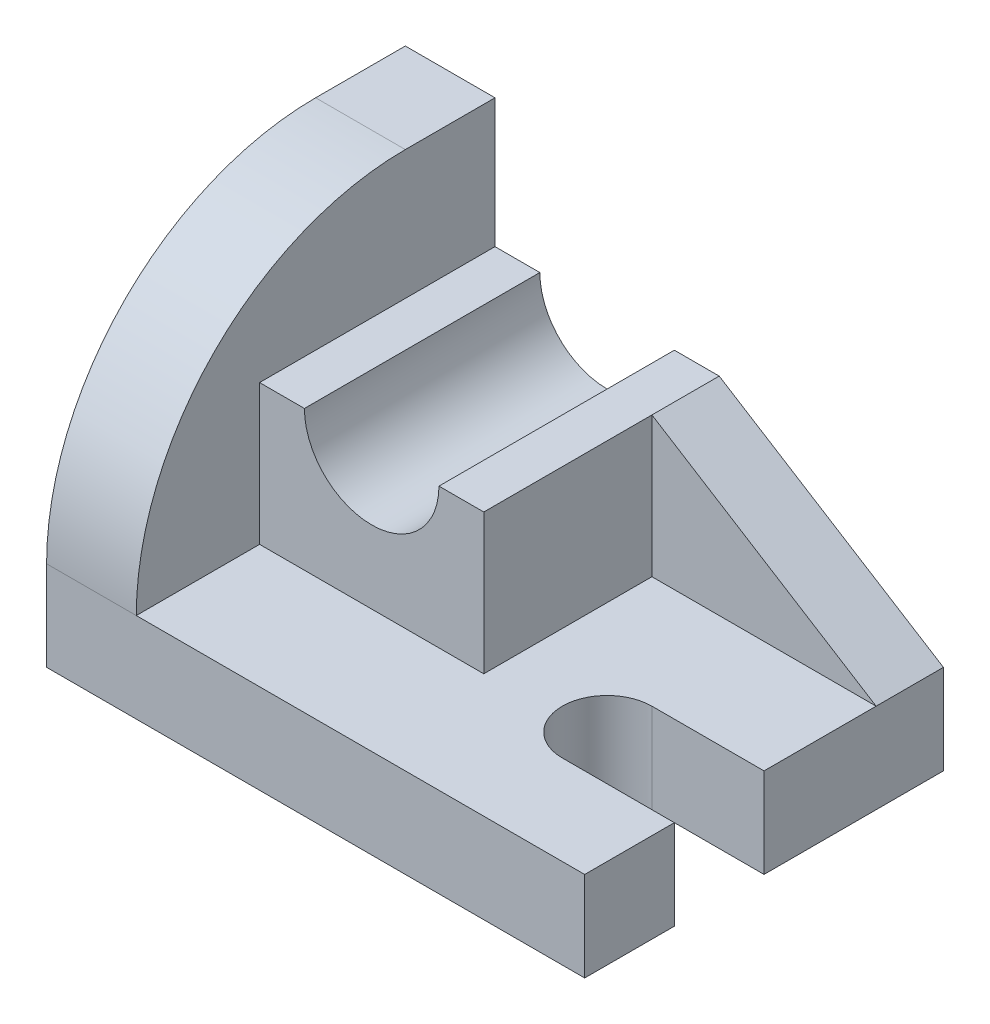
ISO-10303-21;
HEADER;
FILE_DESCRIPTION(('STEP AP214'),'2;1');
FILE_NAME('part.step','',(''),(''),'','','');
FILE_SCHEMA(('AUTOMOTIVE_DESIGN { 1 0 10303 214 1 1 1 1 }'));
ENDSEC;
DATA;
#1=APPLICATION_CONTEXT('core data for automotive mechanical design processes');
#2=APPLICATION_PROTOCOL_DEFINITION('international standard','automotive_design',2000,#1);
#3=PRODUCT_CONTEXT('',#1,'mechanical');
#4=PRODUCT('Part','Part','',(#3));
#5=PRODUCT_RELATED_PRODUCT_CATEGORY('part','',(#4));
#6=PRODUCT_DEFINITION_FORMATION('','',#4);
#7=PRODUCT_DEFINITION_CONTEXT('part definition',#1,'design');
#8=PRODUCT_DEFINITION('design','',#6,#7);
#9=PRODUCT_DEFINITION_SHAPE('','',#8);
#10=(LENGTH_UNIT() NAMED_UNIT(*) SI_UNIT(.MILLI.,.METRE.));
#11=(NAMED_UNIT(*) PLANE_ANGLE_UNIT() SI_UNIT($,.RADIAN.));
#12=(NAMED_UNIT(*) SI_UNIT($,.STERADIAN.) SOLID_ANGLE_UNIT());
#13=UNCERTAINTY_MEASURE_WITH_UNIT(LENGTH_MEASURE(1.E-05),#10,'distance_accuracy_value','');
#14=(GEOMETRIC_REPRESENTATION_CONTEXT(3) GLOBAL_UNCERTAINTY_ASSIGNED_CONTEXT((#13)) GLOBAL_UNIT_ASSIGNED_CONTEXT((#10,
#11,#12)) REPRESENTATION_CONTEXT('',''));
#15=CARTESIAN_POINT('',(0.,0.,0.));
#16=DIRECTION('',(0.,0.,1.));
#17=DIRECTION('',(1.,0.,0.));
#18=AXIS2_PLACEMENT_3D('',#15,#16,#17);
#19=CARTESIAN_POINT('',(0.,16.,0.));
#20=DIRECTION('',(0.,1.,0.));
#21=DIRECTION('',(0.,0.,1.));
#22=AXIS2_PLACEMENT_3D('',#19,#20,#21);
#23=PLANE('',#22);
#24=DIRECTION('',(0.,0.,-1.));
#25=VECTOR('',#24,1.);
#26=CARTESIAN_POINT('',(96.,16.,0.));
#27=LINE('',#26,#25);
#28=CARTESIAN_POINT('',(96.,16.,-32.));
#29=VERTEX_POINT('',#28);
#30=CARTESIAN_POINT('',(96.,16.,-52.));
#31=VERTEX_POINT('',#30);
#32=EDGE_CURVE('E111',#29,#31,#27,.T.);
#33=ORIENTED_EDGE('',*,*,#32,.T.);
#34=DIRECTION('',(-1.,0.,0.));
#35=VECTOR('',#34,1.);
#36=CARTESIAN_POINT('',(56.,16.,-52.));
#37=LINE('',#36,#35);
#38=CARTESIAN_POINT('',(56.,16.,-52.));
#39=VERTEX_POINT('',#38);
#40=EDGE_CURVE('E207',#31,#39,#37,.T.);
#41=ORIENTED_EDGE('',*,*,#40,.T.);
#42=DIRECTION('',(0.,0.,-1.));
#43=VECTOR('',#42,1.);
#44=CARTESIAN_POINT('',(56.,16.,-22.));
#45=LINE('',#44,#43);
#46=CARTESIAN_POINT('',(56.,16.,-22.));
#47=VERTEX_POINT('',#46);
#48=EDGE_CURVE('E167',#47,#39,#45,.T.);
#49=ORIENTED_EDGE('',*,*,#48,.F.);
#50=DIRECTION('',(1.,0.,0.));
#51=VECTOR('',#50,1.);
#52=CARTESIAN_POINT('',(0.,16.,-22.));
#53=LINE('',#52,#51);
#54=CARTESIAN_POINT('',(16.,16.,-22.));
#55=VERTEX_POINT('',#54);
#56=EDGE_CURVE('E186',#55,#47,#53,.T.);
#57=ORIENTED_EDGE('',*,*,#56,.F.);
#58=DIRECTION('',(0.,0.,-1.));
#59=VECTOR('',#58,1.);
#60=CARTESIAN_POINT('',(16.,16.,0.));
#61=LINE('',#60,#59);
#62=CARTESIAN_POINT('',(16.,15.9999999999997,0.));
#63=VERTEX_POINT('',#62);
#64=EDGE_CURVE('E107',#63,#55,#61,.T.);
#65=ORIENTED_EDGE('',*,*,#64,.F.);
#66=DIRECTION('',(1.,0.,0.));
#67=VECTOR('',#66,1.);
#68=CARTESIAN_POINT('',(0.,16.,0.));
#69=LINE('',#68,#67);
#70=CARTESIAN_POINT('',(96.,16.,0.));
#71=VERTEX_POINT('',#70);
#72=EDGE_CURVE('E99',#63,#71,#69,.T.);
#73=ORIENTED_EDGE('',*,*,#72,.T.);
#74=CARTESIAN_POINT('',(96.,16.,-16.));
#75=VERTEX_POINT('',#74);
#76=EDGE_CURVE('E103',#71,#75,#27,.T.);
#77=ORIENTED_EDGE('',*,*,#76,.T.);
#78=DIRECTION('',(-1.,0.,0.));
#79=VECTOR('',#78,1.);
#80=CARTESIAN_POINT('',(0.,16.,-16.));
#81=LINE('',#80,#79);
#82=CARTESIAN_POINT('',(76.,16.,-16.));
#83=VERTEX_POINT('',#82);
#84=EDGE_CURVE('E50',#75,#83,#81,.T.);
#85=ORIENTED_EDGE('',*,*,#84,.T.);
#86=CARTESIAN_POINT('',(76.,16.,-24.));
#87=DIRECTION('',(0.,1.,0.));
#88=DIRECTION('',(0.,0.,1.));
#89=AXIS2_PLACEMENT_3D('',#86,#87,#88);
#90=CIRCLE('',#89,8.);
#91=CARTESIAN_POINT('',(76.,16.,-32.));
#92=VERTEX_POINT('',#91);
#93=EDGE_CURVE('E131',#92,#83,#90,.T.);
#94=ORIENTED_EDGE('',*,*,#93,.F.);
#95=DIRECTION('',(-1.,0.,0.));
#96=VECTOR('',#95,1.);
#97=CARTESIAN_POINT('',(0.,16.,-32.));
#98=LINE('',#97,#96);
#99=EDGE_CURVE('E125',#29,#92,#98,.T.);
#100=ORIENTED_EDGE('',*,*,#99,.F.);
#101=EDGE_LOOP('',(#33,#41,#49,#57,#65,#73,#77,#85,#94,#100));
#102=FACE_BOUND('',#101,.T.);
#103=ADVANCED_FACE('F33',(#102),#23,.T.);
#104=CARTESIAN_POINT('',(56.,0.,-22.));
#105=DIRECTION('',(-1.,0.,0.));
#106=DIRECTION('',(0.,0.,1.));
#107=AXIS2_PLACEMENT_3D('',#104,#105,#106);
#108=PLANE('',#107);
#109=DIRECTION('',(0.,1.,0.));
#110=VECTOR('',#109,1.);
#111=CARTESIAN_POINT('',(56.,41.,-52.));
#112=LINE('',#111,#110);
#113=CARTESIAN_POINT('',(56.,41.,-52.));
#114=VERTEX_POINT('',#113);
#115=EDGE_CURVE('E210',#39,#114,#112,.T.);
#116=ORIENTED_EDGE('',*,*,#115,.T.);
#117=DIRECTION('',(0.,0.,-1.));
#118=VECTOR('',#117,1.);
#119=CARTESIAN_POINT('',(56.,41.,-22.));
#120=LINE('',#119,#118);
#121=CARTESIAN_POINT('',(56.,41.,-22.));
#122=VERTEX_POINT('',#121);
#123=EDGE_CURVE('E163',#122,#114,#120,.T.);
#124=ORIENTED_EDGE('',*,*,#123,.F.);
#125=DIRECTION('',(0.,1.,0.));
#126=VECTOR('',#125,1.);
#127=CARTESIAN_POINT('',(56.,0.,-22.));
#128=LINE('',#127,#126);
#129=EDGE_CURVE('E189',#47,#122,#128,.T.);
#130=ORIENTED_EDGE('',*,*,#129,.F.);
#131=ORIENTED_EDGE('',*,*,#48,.T.);
#132=EDGE_LOOP('',(#116,#124,#130,#131));
#133=FACE_BOUND('',#132,.T.);
#134=ADVANCED_FACE('F225',(#133),#108,.F.);
#135=CARTESIAN_POINT('',(76.,16.,-24.));
#136=DIRECTION('',(0.,-1.,0.));
#137=DIRECTION('',(0.,0.,-1.));
#138=AXIS2_PLACEMENT_3D('',#135,#136,#137);
#139=CYLINDRICAL_SURFACE('',#138,8.);
#140=CARTESIAN_POINT('',(76.,0.,-24.));
#141=DIRECTION('',(0.,1.,0.));
#142=DIRECTION('',(0.,0.,1.));
#143=AXIS2_PLACEMENT_3D('',#140,#141,#142);
#144=CIRCLE('',#143,8.);
#145=CARTESIAN_POINT('',(76.,0.,-32.));
#146=VERTEX_POINT('',#145);
#147=CARTESIAN_POINT('',(76.,0.,-16.));
#148=VERTEX_POINT('',#147);
#149=EDGE_CURVE('E137',#146,#148,#144,.T.);
#150=ORIENTED_EDGE('',*,*,#149,.F.);
#151=DIRECTION('',(0.,-1.,0.));
#152=VECTOR('',#151,1.);
#153=CARTESIAN_POINT('',(76.,16.,-32.));
#154=LINE('',#153,#152);
#155=EDGE_CURVE('E11',#92,#146,#154,.T.);
#156=ORIENTED_EDGE('',*,*,#155,.F.);
#157=ORIENTED_EDGE('',*,*,#93,.T.);
#158=DIRECTION('',(0.,-1.,0.));
#159=VECTOR('',#158,1.);
#160=CARTESIAN_POINT('',(76.,16.,-16.));
#161=LINE('',#160,#159);
#162=EDGE_CURVE('E86',#83,#148,#161,.T.);
#163=ORIENTED_EDGE('',*,*,#162,.T.);
#164=EDGE_LOOP('',(#150,#156,#157,#163));
#165=FACE_BOUND('',#164,.T.);
#166=ADVANCED_FACE('F35',(#165),#139,.F.);
#167=CARTESIAN_POINT('',(0.,16.,-32.));
#168=DIRECTION('',(0.,0.,1.));
#169=DIRECTION('',(1.,0.,0.));
#170=AXIS2_PLACEMENT_3D('',#167,#168,#169);
#171=PLANE('',#170);
#172=DIRECTION('',(-1.,0.,0.));
#173=VECTOR('',#172,1.);
#174=CARTESIAN_POINT('',(0.,0.,-32.));
#175=LINE('',#174,#173);
#176=CARTESIAN_POINT('',(96.,0.,-32.));
#177=VERTEX_POINT('',#176);
#178=EDGE_CURVE('E322',#177,#146,#175,.T.);
#179=ORIENTED_EDGE('',*,*,#178,.F.);
#180=DIRECTION('',(0.,-1.,0.));
#181=VECTOR('',#180,1.);
#182=CARTESIAN_POINT('',(96.,16.,-32.));
#183=LINE('',#182,#181);
#184=EDGE_CURVE('E42',#29,#177,#183,.T.);
#185=ORIENTED_EDGE('',*,*,#184,.F.);
#186=ORIENTED_EDGE('',*,*,#99,.T.);
#187=ORIENTED_EDGE('',*,*,#155,.T.);
#188=EDGE_LOOP('',(#179,#185,#186,#187));
#189=FACE_BOUND('',#188,.T.);
#190=ADVANCED_FACE('F331',(#189),#171,.T.);
#191=CARTESIAN_POINT('',(96.,16.,0.));
#192=DIRECTION('',(-1.,0.,0.));
#193=DIRECTION('',(0.,0.,1.));
#194=AXIS2_PLACEMENT_3D('',#191,#192,#193);
#195=PLANE('',#194);
#196=DIRECTION('',(0.,0.,-1.));
#197=VECTOR('',#196,1.);
#198=CARTESIAN_POINT('',(96.,0.,0.));
#199=LINE('',#198,#197);
#200=CARTESIAN_POINT('',(96.,0.,-64.));
#201=VERTEX_POINT('',#200);
#202=EDGE_CURVE('E310',#177,#201,#199,.T.);
#203=ORIENTED_EDGE('',*,*,#202,.T.);
#204=DIRECTION('',(0.,-1.,0.));
#205=VECTOR('',#204,1.);
#206=CARTESIAN_POINT('',(96.,16.,-64.));
#207=LINE('',#206,#205);
#208=CARTESIAN_POINT('',(96.,16.,-64.));
#209=VERTEX_POINT('',#208);
#210=EDGE_CURVE('E277',#209,#201,#207,.T.);
#211=ORIENTED_EDGE('',*,*,#210,.F.);
#212=DIRECTION('',(0.,0.,-1.));
#213=VECTOR('',#212,1.);
#214=CARTESIAN_POINT('',(96.,16.,-52.));
#215=LINE('',#214,#213);
#216=EDGE_CURVE('E182',#31,#209,#215,.T.);
#217=ORIENTED_EDGE('',*,*,#216,.F.);
#218=ORIENTED_EDGE('',*,*,#32,.F.);
#219=ORIENTED_EDGE('',*,*,#184,.T.);
#220=EDGE_LOOP('',(#203,#211,#217,#218,#219));
#221=FACE_BOUND('',#220,.T.);
#222=ADVANCED_FACE('F308',(#221),#195,.F.);
#223=CARTESIAN_POINT('',(0.,16.,-64.));
#224=DIRECTION('',(0.,0.,-1.));
#225=DIRECTION('',(-1.,0.,0.));
#226=AXIS2_PLACEMENT_3D('',#223,#224,#225);
#227=PLANE('',#226);
#228=DIRECTION('',(0.847998304005088,-0.52999894000318,0.));
#229=VECTOR('',#228,1.);
#230=CARTESIAN_POINT('',(96.,16.,-64.));
#231=LINE('',#230,#229);
#232=CARTESIAN_POINT('',(56.,41.,-64.));
#233=VERTEX_POINT('',#232);
#234=EDGE_CURVE('E204',#233,#209,#231,.T.);
#235=ORIENTED_EDGE('',*,*,#234,.T.);
#236=ORIENTED_EDGE('',*,*,#210,.T.);
#237=DIRECTION('',(1.,0.,0.));
#238=VECTOR('',#237,1.);
#239=CARTESIAN_POINT('',(0.,0.,-64.));
#240=LINE('',#239,#238);
#241=CARTESIAN_POINT('',(0.,0.,-64.));
#242=VERTEX_POINT('',#241);
#243=EDGE_CURVE('E273',#242,#201,#240,.T.);
#244=ORIENTED_EDGE('',*,*,#243,.F.);
#245=DIRECTION('',(0.,-1.,0.));
#246=VECTOR('',#245,1.);
#247=CARTESIAN_POINT('',(0.,16.,-64.));
#248=LINE('',#247,#246);
#249=CARTESIAN_POINT('',(0.,64.,-64.));
#250=VERTEX_POINT('',#249);
#251=EDGE_CURVE('E269',#250,#242,#248,.T.);
#252=ORIENTED_EDGE('',*,*,#251,.F.);
#253=DIRECTION('',(-1.,0.,0.));
#254=VECTOR('',#253,1.);
#255=CARTESIAN_POINT('',(16.,64.,-64.));
#256=LINE('',#255,#254);
#257=CARTESIAN_POINT('',(16.,64.,-64.));
#258=VERTEX_POINT('',#257);
#259=EDGE_CURVE('E138',#258,#250,#256,.T.);
#260=ORIENTED_EDGE('',*,*,#259,.F.);
#261=DIRECTION('',(0.,-1.,0.));
#262=VECTOR('',#261,1.);
#263=CARTESIAN_POINT('',(16.,0.,-64.));
#264=LINE('',#263,#262);
#265=CARTESIAN_POINT('',(16.,41.,-64.));
#266=VERTEX_POINT('',#265);
#267=EDGE_CURVE('E142',#258,#266,#264,.T.);
#268=ORIENTED_EDGE('',*,*,#267,.T.);
#269=DIRECTION('',(1.,0.,0.));
#270=VECTOR('',#269,1.);
#271=CARTESIAN_POINT('',(0.,41.,-64.));
#272=LINE('',#271,#270);
#273=CARTESIAN_POINT('',(24.,41.,-64.));
#274=VERTEX_POINT('',#273);
#275=EDGE_CURVE('E178',#266,#274,#272,.T.);
#276=ORIENTED_EDGE('',*,*,#275,.T.);
#277=CARTESIAN_POINT('',(36.,41.,-64.));
#278=DIRECTION('',(0.,0.,-1.));
#279=DIRECTION('',(-1.,0.,0.));
#280=AXIS2_PLACEMENT_3D('',#277,#278,#279);
#281=CIRCLE('',#280,12.);
#282=CARTESIAN_POINT('',(48.,41.,-64.));
#283=VERTEX_POINT('',#282);
#284=EDGE_CURVE('E179',#283,#274,#281,.T.);
#285=ORIENTED_EDGE('',*,*,#284,.F.);
#286=EDGE_CURVE('E175',#283,#233,#272,.T.);
#287=ORIENTED_EDGE('',*,*,#286,.T.);
#288=EDGE_LOOP('',(#235,#236,#244,#252,#260,#268,#276,#285,#287));
#289=FACE_BOUND('',#288,.T.);
#290=ADVANCED_FACE('F270',(#289),#227,.T.);
#291=CARTESIAN_POINT('',(0.,16.,0.));
#292=DIRECTION('',(-1.,0.,0.));
#293=DIRECTION('',(0.,0.,1.));
#294=AXIS2_PLACEMENT_3D('',#291,#292,#293);
#295=PLANE('',#294);
#296=DIRECTION('',(0.,0.,-1.));
#297=VECTOR('',#296,1.);
#298=CARTESIAN_POINT('',(0.,0.,0.));
#299=LINE('',#298,#297);
#300=CARTESIAN_POINT('',(0.,0.,0.));
#301=VERTEX_POINT('',#300);
#302=EDGE_CURVE('E318',#301,#242,#299,.T.);
#303=ORIENTED_EDGE('',*,*,#302,.F.);
#304=DIRECTION('',(0.,-1.,0.));
#305=VECTOR('',#304,1.);
#306=CARTESIAN_POINT('',(0.,16.,0.));
#307=LINE('',#306,#305);
#308=CARTESIAN_POINT('',(0.,15.9999999999997,0.));
#309=VERTEX_POINT('',#308);
#310=EDGE_CURVE('E117',#309,#301,#307,.T.);
#311=ORIENTED_EDGE('',*,*,#310,.F.);
#312=CARTESIAN_POINT('',(0.,16.,-48.));
#313=DIRECTION('',(-1.,0.,0.));
#314=DIRECTION('',(0.,0.,-1.));
#315=AXIS2_PLACEMENT_3D('',#312,#313,#314);
#316=CIRCLE('',#315,48.);
#317=CARTESIAN_POINT('',(0.,64.,-48.0000000000004));
#318=VERTEX_POINT('',#317);
#319=EDGE_CURVE('E149',#309,#318,#316,.T.);
#320=ORIENTED_EDGE('',*,*,#319,.T.);
#321=DIRECTION('',(0.,0.,-1.));
#322=VECTOR('',#321,1.);
#323=CARTESIAN_POINT('',(0.,64.,-48.0000000000004));
#324=LINE('',#323,#322);
#325=EDGE_CURVE('E145',#318,#250,#324,.T.);
#326=ORIENTED_EDGE('',*,*,#325,.T.);
#327=ORIENTED_EDGE('',*,*,#251,.T.);
#328=EDGE_LOOP('',(#303,#311,#320,#326,#327));
#329=FACE_BOUND('',#328,.T.);
#330=ADVANCED_FACE('F282',(#329),#295,.T.);
#331=CARTESIAN_POINT('',(0.,16.,0.));
#332=DIRECTION('',(0.,0.,-1.));
#333=DIRECTION('',(-1.,0.,0.));
#334=AXIS2_PLACEMENT_3D('',#331,#332,#333);
#335=PLANE('',#334);
#336=ORIENTED_EDGE('',*,*,#72,.F.);
#337=EDGE_CURVE('E110',#309,#63,#69,.T.);
#338=ORIENTED_EDGE('',*,*,#337,.F.);
#339=ORIENTED_EDGE('',*,*,#310,.T.);
#340=DIRECTION('',(1.,0.,0.));
#341=VECTOR('',#340,1.);
#342=CARTESIAN_POINT('',(0.,0.,0.));
#343=LINE('',#342,#341);
#344=CARTESIAN_POINT('',(96.,0.,0.));
#345=VERTEX_POINT('',#344);
#346=EDGE_CURVE('E116',#301,#345,#343,.T.);
#347=ORIENTED_EDGE('',*,*,#346,.T.);
#348=DIRECTION('',(0.,-1.,0.));
#349=VECTOR('',#348,1.);
#350=CARTESIAN_POINT('',(96.,16.,0.));
#351=LINE('',#350,#349);
#352=EDGE_CURVE('E113',#71,#345,#351,.T.);
#353=ORIENTED_EDGE('',*,*,#352,.F.);
#354=EDGE_LOOP('',(#336,#338,#339,#347,#353));
#355=FACE_BOUND('',#354,.T.);
#356=ADVANCED_FACE('F114',(#355),#335,.F.);
#357=CARTESIAN_POINT('',(96.,0.,-16.));
#358=VERTEX_POINT('',#357);
#359=EDGE_CURVE('E79',#345,#358,#199,.T.);
#360=ORIENTED_EDGE('',*,*,#359,.T.);
#361=DIRECTION('',(0.,-1.,0.));
#362=VECTOR('',#361,1.);
#363=CARTESIAN_POINT('',(96.,16.,-16.));
#364=LINE('',#363,#362);
#365=EDGE_CURVE('E118',#75,#358,#364,.T.);
#366=ORIENTED_EDGE('',*,*,#365,.F.);
#367=ORIENTED_EDGE('',*,*,#76,.F.);
#368=ORIENTED_EDGE('',*,*,#352,.T.);
#369=EDGE_LOOP('',(#360,#366,#367,#368));
#370=FACE_BOUND('',#369,.T.);
#371=ADVANCED_FACE('F120',(#370),#195,.F.);
#372=CARTESIAN_POINT('',(0.,16.,-16.));
#373=DIRECTION('',(0.,0.,1.));
#374=DIRECTION('',(1.,0.,0.));
#375=AXIS2_PLACEMENT_3D('',#372,#373,#374);
#376=PLANE('',#375);
#377=DIRECTION('',(-1.,0.,0.));
#378=VECTOR('',#377,1.);
#379=CARTESIAN_POINT('',(0.,0.,-16.));
#380=LINE('',#379,#378);
#381=EDGE_CURVE('E133',#358,#148,#380,.T.);
#382=ORIENTED_EDGE('',*,*,#381,.T.);
#383=ORIENTED_EDGE('',*,*,#162,.F.);
#384=ORIENTED_EDGE('',*,*,#84,.F.);
#385=ORIENTED_EDGE('',*,*,#365,.T.);
#386=EDGE_LOOP('',(#382,#383,#384,#385));
#387=FACE_BOUND('',#386,.T.);
#388=ADVANCED_FACE('F346',(#387),#376,.F.);
#389=CARTESIAN_POINT('',(0.,0.,0.));
#390=DIRECTION('',(0.,1.,0.));
#391=DIRECTION('',(0.,0.,1.));
#392=AXIS2_PLACEMENT_3D('',#389,#390,#391);
#393=PLANE('',#392);
#394=ORIENTED_EDGE('',*,*,#359,.F.);
#395=ORIENTED_EDGE('',*,*,#346,.F.);
#396=ORIENTED_EDGE('',*,*,#302,.T.);
#397=ORIENTED_EDGE('',*,*,#243,.T.);
#398=ORIENTED_EDGE('',*,*,#202,.F.);
#399=ORIENTED_EDGE('',*,*,#178,.T.);
#400=ORIENTED_EDGE('',*,*,#149,.T.);
#401=ORIENTED_EDGE('',*,*,#381,.F.);
#402=EDGE_LOOP('',(#394,#395,#396,#397,#398,#399,#400,#401));
#403=FACE_BOUND('',#402,.T.);
#404=ADVANCED_FACE('F328',(#403),#393,.F.);
#405=CARTESIAN_POINT('',(16.,64.,-48.0000000000004));
#406=DIRECTION('',(0.,1.,0.));
#407=DIRECTION('',(0.,0.,1.));
#408=AXIS2_PLACEMENT_3D('',#405,#406,#407);
#409=PLANE('',#408);
#410=ORIENTED_EDGE('',*,*,#325,.F.);
#411=DIRECTION('',(-1.,0.,0.));
#412=VECTOR('',#411,1.);
#413=CARTESIAN_POINT('',(16.,64.,-48.0000000000004));
#414=LINE('',#413,#412);
#415=CARTESIAN_POINT('',(16.,64.,-48.0000000000004));
#416=VERTEX_POINT('',#415);
#417=EDGE_CURVE('E139',#416,#318,#414,.T.);
#418=ORIENTED_EDGE('',*,*,#417,.F.);
#419=DIRECTION('',(0.,0.,-1.));
#420=VECTOR('',#419,1.);
#421=CARTESIAN_POINT('',(16.,64.,-48.0000000000004));
#422=LINE('',#421,#420);
#423=EDGE_CURVE('E155',#416,#258,#422,.T.);
#424=ORIENTED_EDGE('',*,*,#423,.T.);
#425=ORIENTED_EDGE('',*,*,#259,.T.);
#426=EDGE_LOOP('',(#410,#418,#424,#425));
#427=FACE_BOUND('',#426,.T.);
#428=ADVANCED_FACE('F280',(#427),#409,.T.);
#429=CARTESIAN_POINT('',(16.,16.,-48.));
#430=DIRECTION('',(-1.,0.,0.));
#431=DIRECTION('',(0.,0.,1.));
#432=AXIS2_PLACEMENT_3D('',#429,#430,#431);
#433=CYLINDRICAL_SURFACE('',#432,48.);
#434=ORIENTED_EDGE('',*,*,#319,.F.);
#435=ORIENTED_EDGE('',*,*,#337,.T.);
#436=CARTESIAN_POINT('',(16.,16.,-48.));
#437=DIRECTION('',(-1.,0.,0.));
#438=DIRECTION('',(0.,0.,-1.));
#439=AXIS2_PLACEMENT_3D('',#436,#437,#438);
#440=CIRCLE('',#439,48.);
#441=EDGE_CURVE('E148',#63,#416,#440,.T.);
#442=ORIENTED_EDGE('',*,*,#441,.T.);
#443=ORIENTED_EDGE('',*,*,#417,.T.);
#444=EDGE_LOOP('',(#434,#435,#442,#443));
#445=FACE_BOUND('',#444,.T.);
#446=ADVANCED_FACE('F284',(#445),#433,.T.);
#447=CARTESIAN_POINT('',(16.,16.,-48.));
#448=DIRECTION('',(1.,0.,0.));
#449=DIRECTION('',(0.,0.,-1.));
#450=AXIS2_PLACEMENT_3D('',#447,#448,#449);
#451=PLANE('',#450);
#452=DIRECTION('',(0.,0.,-1.));
#453=VECTOR('',#452,1.);
#454=CARTESIAN_POINT('',(16.,41.,-22.));
#455=LINE('',#454,#453);
#456=CARTESIAN_POINT('',(16.,41.,-22.));
#457=VERTEX_POINT('',#456);
#458=EDGE_CURVE('E170',#457,#266,#455,.T.);
#459=ORIENTED_EDGE('',*,*,#458,.T.);
#460=ORIENTED_EDGE('',*,*,#267,.F.);
#461=ORIENTED_EDGE('',*,*,#423,.F.);
#462=ORIENTED_EDGE('',*,*,#441,.F.);
#463=ORIENTED_EDGE('',*,*,#64,.T.);
#464=DIRECTION('',(0.,-1.,0.));
#465=VECTOR('',#464,1.);
#466=CARTESIAN_POINT('',(16.,0.,-22.));
#467=LINE('',#466,#465);
#468=EDGE_CURVE('E183',#457,#55,#467,.T.);
#469=ORIENTED_EDGE('',*,*,#468,.F.);
#470=EDGE_LOOP('',(#459,#460,#461,#462,#463,#469));
#471=FACE_BOUND('',#470,.T.);
#472=ADVANCED_FACE('F287',(#471),#451,.T.);
#473=CARTESIAN_POINT('',(36.,41.,-22.));
#474=DIRECTION('',(0.,0.,-1.));
#475=DIRECTION('',(-1.,0.,0.));
#476=AXIS2_PLACEMENT_3D('',#473,#474,#475);
#477=CYLINDRICAL_SURFACE('',#476,12.);
#478=ORIENTED_EDGE('',*,*,#284,.T.);
#479=DIRECTION('',(0.,0.,-1.));
#480=VECTOR('',#479,1.);
#481=CARTESIAN_POINT('',(24.,41.,-22.));
#482=LINE('',#481,#480);
#483=CARTESIAN_POINT('',(24.,41.,-22.));
#484=VERTEX_POINT('',#483);
#485=EDGE_CURVE('E152',#484,#274,#482,.T.);
#486=ORIENTED_EDGE('',*,*,#485,.F.);
#487=CARTESIAN_POINT('',(36.,41.,-22.));
#488=DIRECTION('',(0.,0.,-1.));
#489=DIRECTION('',(-1.,0.,0.));
#490=AXIS2_PLACEMENT_3D('',#487,#488,#489);
#491=CIRCLE('',#490,12.);
#492=CARTESIAN_POINT('',(48.,41.,-22.));
#493=VERTEX_POINT('',#492);
#494=EDGE_CURVE('E195',#493,#484,#491,.T.);
#495=ORIENTED_EDGE('',*,*,#494,.F.);
#496=DIRECTION('',(0.,0.,-1.));
#497=VECTOR('',#496,1.);
#498=CARTESIAN_POINT('',(48.,41.,-22.));
#499=LINE('',#498,#497);
#500=EDGE_CURVE('E160',#493,#283,#499,.T.);
#501=ORIENTED_EDGE('',*,*,#500,.T.);
#502=EDGE_LOOP('',(#478,#486,#495,#501));
#503=FACE_BOUND('',#502,.T.);
#504=ADVANCED_FACE('F299',(#503),#477,.F.);
#505=CARTESIAN_POINT('',(0.,41.,-22.));
#506=DIRECTION('',(0.,1.,0.));
#507=DIRECTION('',(-1.,0.,0.));
#508=AXIS2_PLACEMENT_3D('',#505,#506,#507);
#509=PLANE('',#508);
#510=ORIENTED_EDGE('',*,*,#275,.F.);
#511=ORIENTED_EDGE('',*,*,#458,.F.);
#512=DIRECTION('',(1.,0.,0.));
#513=VECTOR('',#512,1.);
#514=CARTESIAN_POINT('',(0.,41.,-22.));
#515=LINE('',#514,#513);
#516=EDGE_CURVE('E164',#457,#484,#515,.T.);
#517=ORIENTED_EDGE('',*,*,#516,.T.);
#518=ORIENTED_EDGE('',*,*,#485,.T.);
#519=EDGE_LOOP('',(#510,#511,#517,#518));
#520=FACE_BOUND('',#519,.T.);
#521=ADVANCED_FACE('F293',(#520),#509,.T.);
#522=ORIENTED_EDGE('',*,*,#286,.F.);
#523=ORIENTED_EDGE('',*,*,#500,.F.);
#524=EDGE_CURVE('E192',#493,#122,#515,.T.);
#525=ORIENTED_EDGE('',*,*,#524,.T.);
#526=ORIENTED_EDGE('',*,*,#123,.T.);
#527=DIRECTION('',(0.,0.,-1.));
#528=VECTOR('',#527,1.);
#529=CARTESIAN_POINT('',(56.,41.,-52.));
#530=LINE('',#529,#528);
#531=EDGE_CURVE('E198',#114,#233,#530,.T.);
#532=ORIENTED_EDGE('',*,*,#531,.T.);
#533=EDGE_LOOP('',(#522,#523,#525,#526,#532));
#534=FACE_BOUND('',#533,.T.);
#535=ADVANCED_FACE('F301',(#534),#509,.T.);
#536=CARTESIAN_POINT('',(0.,0.,-22.));
#537=DIRECTION('',(0.,0.,-1.));
#538=DIRECTION('',(-1.,0.,0.));
#539=AXIS2_PLACEMENT_3D('',#536,#537,#538);
#540=PLANE('',#539);
#541=ORIENTED_EDGE('',*,*,#494,.T.);
#542=ORIENTED_EDGE('',*,*,#516,.F.);
#543=ORIENTED_EDGE('',*,*,#468,.T.);
#544=ORIENTED_EDGE('',*,*,#56,.T.);
#545=ORIENTED_EDGE('',*,*,#129,.T.);
#546=ORIENTED_EDGE('',*,*,#524,.F.);
#547=EDGE_LOOP('',(#541,#542,#543,#544,#545,#546));
#548=FACE_BOUND('',#547,.T.);
#549=ADVANCED_FACE('F232',(#548),#540,.F.);
#550=CARTESIAN_POINT('',(96.,16.,-52.));
#551=DIRECTION('',(0.52999894000318,0.847998304005088,0.));
#552=DIRECTION('',(-0.847998304005088,0.52999894000318,0.));
#553=AXIS2_PLACEMENT_3D('',#550,#551,#552);
#554=PLANE('',#553);
#555=ORIENTED_EDGE('',*,*,#234,.F.);
#556=ORIENTED_EDGE('',*,*,#531,.F.);
#557=DIRECTION('',(0.847998304005088,-0.52999894000318,0.));
#558=VECTOR('',#557,1.);
#559=CARTESIAN_POINT('',(96.,16.,-52.));
#560=LINE('',#559,#558);
#561=EDGE_CURVE('E201',#114,#31,#560,.T.);
#562=ORIENTED_EDGE('',*,*,#561,.T.);
#563=ORIENTED_EDGE('',*,*,#216,.T.);
#564=EDGE_LOOP('',(#555,#556,#562,#563));
#565=FACE_BOUND('',#564,.T.);
#566=ADVANCED_FACE('F450',(#565),#554,.T.);
#567=CARTESIAN_POINT('',(0.,0.,-52.));
#568=DIRECTION('',(0.,0.,-1.));
#569=DIRECTION('',(-1.,0.,0.));
#570=AXIS2_PLACEMENT_3D('',#567,#568,#569);
#571=PLANE('',#570);
#572=ORIENTED_EDGE('',*,*,#40,.F.);
#573=ORIENTED_EDGE('',*,*,#561,.F.);
#574=ORIENTED_EDGE('',*,*,#115,.F.);
#575=EDGE_LOOP('',(#572,#573,#574));
#576=FACE_BOUND('',#575,.T.);
#577=ADVANCED_FACE('F477',(#576),#571,.F.);
#578=CLOSED_SHELL('',(#103,#134,#166,#190,#222,#290,#330,#356,#371,#388,#404,#428,#446,#472,
#504,#521,#535,#549,#566,#577));
#579=MANIFOLD_SOLID_BREP('B2',#578);
#580=ADVANCED_BREP_SHAPE_REPRESENTATION('',(#18,#579),#14);
#581=SHAPE_DEFINITION_REPRESENTATION(#9,#580);
ENDSEC;
END-ISO-10303-21;
